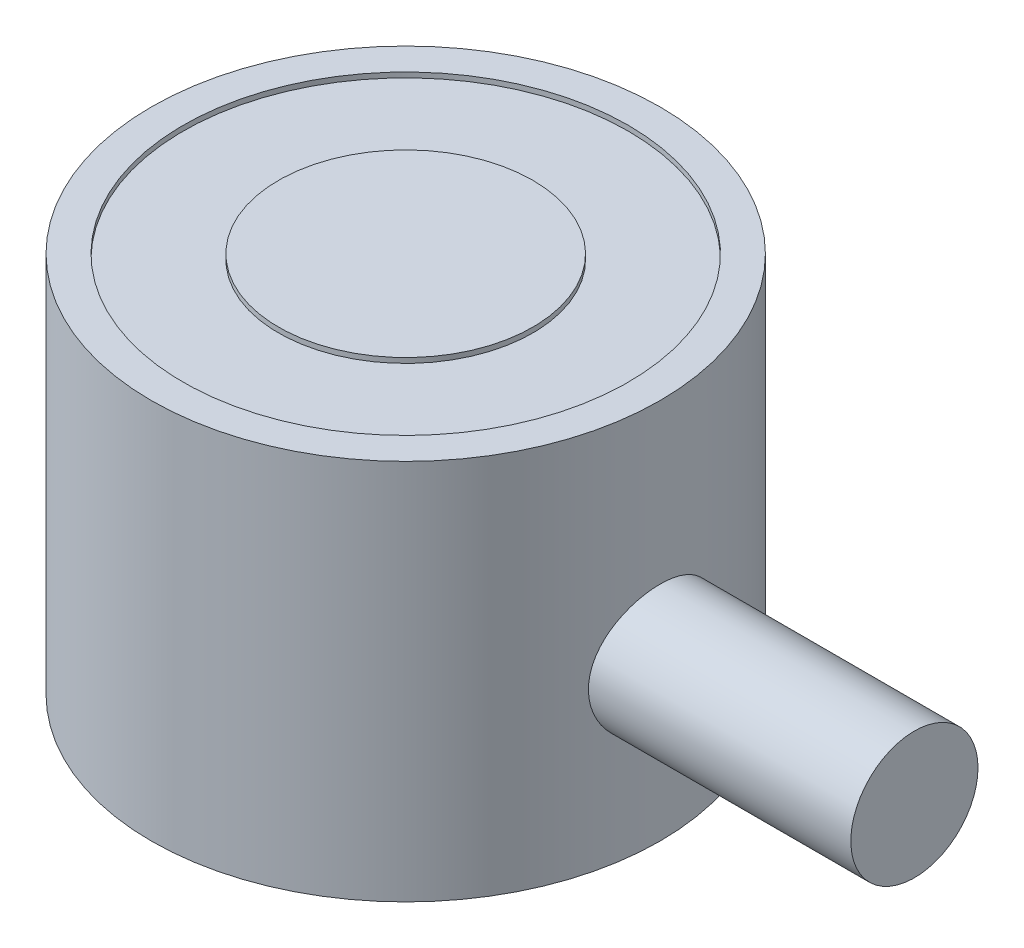
ISO-10303-21;
HEADER;
FILE_DESCRIPTION(('STEP AP214'),'2;1');
FILE_NAME('part.step','',(''),(''),'','','');
FILE_SCHEMA(('AUTOMOTIVE_DESIGN { 1 0 10303 214 1 1 1 1 }'));
ENDSEC;
DATA;
#1=APPLICATION_CONTEXT('core data for automotive mechanical design processes');
#2=APPLICATION_PROTOCOL_DEFINITION('international standard','automotive_design',2000,#1);
#3=PRODUCT_CONTEXT('',#1,'mechanical');
#4=PRODUCT('Part','Part','',(#3));
#5=PRODUCT_RELATED_PRODUCT_CATEGORY('part','',(#4));
#6=PRODUCT_DEFINITION_FORMATION('','',#4);
#7=PRODUCT_DEFINITION_CONTEXT('part definition',#1,'design');
#8=PRODUCT_DEFINITION('design','',#6,#7);
#9=PRODUCT_DEFINITION_SHAPE('','',#8);
#10=(LENGTH_UNIT() NAMED_UNIT(*) SI_UNIT(.MILLI.,.METRE.));
#11=(NAMED_UNIT(*) PLANE_ANGLE_UNIT() SI_UNIT($,.RADIAN.));
#12=(NAMED_UNIT(*) SI_UNIT($,.STERADIAN.) SOLID_ANGLE_UNIT());
#13=UNCERTAINTY_MEASURE_WITH_UNIT(LENGTH_MEASURE(1.E-05),#10,'distance_accuracy_value','');
#14=(GEOMETRIC_REPRESENTATION_CONTEXT(3) GLOBAL_UNCERTAINTY_ASSIGNED_CONTEXT((#13)) GLOBAL_UNIT_ASSIGNED_CONTEXT((#10,
#11,#12)) REPRESENTATION_CONTEXT('',''));
#15=CARTESIAN_POINT('',(0.,0.,0.));
#16=DIRECTION('',(0.,0.,1.));
#17=DIRECTION('',(1.,0.,0.));
#18=AXIS2_PLACEMENT_3D('',#15,#16,#17);
#19=CARTESIAN_POINT('',(0.,0.,0.));
#20=DIRECTION('',(0.,1.,0.));
#21=DIRECTION('',(0.,0.,1.));
#22=AXIS2_PLACEMENT_3D('',#19,#20,#21);
#23=PLANE('',#22);
#24=CARTESIAN_POINT('',(0.,0.,0.));
#25=DIRECTION('',(0.,1.,0.));
#26=DIRECTION('',(0.,0.,1.));
#27=AXIS2_PLACEMENT_3D('',#24,#25,#26);
#28=CIRCLE('',#27,12.7);
#29=CARTESIAN_POINT('',(0.,0.,12.7));
#30=VERTEX_POINT('',#29);
#31=EDGE_CURVE('E39',#30,#30,#28,.T.);
#32=ORIENTED_EDGE('',*,*,#31,.F.);
#33=EDGE_LOOP('',(#32));
#34=FACE_BOUND('',#33,.T.);
#35=CARTESIAN_POINT('',(0.,0.,0.));
#36=DIRECTION('',(0.,-1.,0.));
#37=DIRECTION('',(0.,0.,-1.));
#38=AXIS2_PLACEMENT_3D('',#35,#36,#37);
#39=CIRCLE('',#38,2.49892595803174);
#40=CARTESIAN_POINT('',(0.,0.,-2.49892595803174));
#41=VERTEX_POINT('',#40);
#42=EDGE_CURVE('E60',#41,#41,#39,.T.);
#43=ORIENTED_EDGE('',*,*,#42,.F.);
#44=EDGE_LOOP('',(#43));
#45=FACE_BOUND('',#44,.T.);
#46=ADVANCED_FACE('F31',(#34,#45),#23,.F.);
#47=CARTESIAN_POINT('',(0.,19.05,0.));
#48=DIRECTION('',(0.,1.,0.));
#49=DIRECTION('',(0.,0.,1.));
#50=AXIS2_PLACEMENT_3D('',#47,#48,#49);
#51=PLANE('',#50);
#52=CARTESIAN_POINT('',(0.,19.05,0.));
#53=DIRECTION('',(0.,1.,0.));
#54=DIRECTION('',(0.,0.,1.));
#55=AXIS2_PLACEMENT_3D('',#52,#53,#54);
#56=CIRCLE('',#55,12.7);
#57=CARTESIAN_POINT('',(0.,19.05,12.7));
#58=VERTEX_POINT('',#57);
#59=EDGE_CURVE('E10',#58,#58,#56,.T.);
#60=ORIENTED_EDGE('',*,*,#59,.T.);
#61=EDGE_LOOP('',(#60));
#62=FACE_BOUND('',#61,.T.);
#63=CARTESIAN_POINT('',(0.,19.05,0.));
#64=DIRECTION('',(0.,-1.,0.));
#65=DIRECTION('',(0.,0.,-1.));
#66=AXIS2_PLACEMENT_3D('',#63,#64,#65);
#67=CIRCLE('',#66,11.1125);
#68=CARTESIAN_POINT('',(0.,19.05,-11.1125));
#69=VERTEX_POINT('',#68);
#70=EDGE_CURVE('E51',#69,#69,#67,.T.);
#71=ORIENTED_EDGE('',*,*,#70,.T.);
#72=EDGE_LOOP('',(#71));
#73=FACE_BOUND('',#72,.T.);
#74=ADVANCED_FACE('F91',(#62,#73),#51,.T.);
#75=CARTESIAN_POINT('',(0.,19.05,0.));
#76=DIRECTION('',(0.,-1.,0.));
#77=DIRECTION('',(0.,0.,-1.));
#78=AXIS2_PLACEMENT_3D('',#75,#76,#77);
#79=CYLINDRICAL_SURFACE('',#78,12.7);
#80=CARTESIAN_POINT('',(12.2967221242086,7.9375,-3.175));
#81=CARTESIAN_POINT('',(12.2967254711158,8.11282445367675,-3.1749950198132));
#82=CARTESIAN_POINT('',(12.3005126863854,8.28820402132172,-3.16042833178202));
#83=CARTESIAN_POINT('',(12.3152136473056,8.63392682428036,-3.10263936933902));
#84=CARTESIAN_POINT('',(12.3261315404947,8.80426706817459,-3.05940041756247));
#85=CARTESIAN_POINT('',(12.3537818023711,9.13486049349772,-2.94575382353269));
#86=CARTESIAN_POINT('',(12.3705066621688,9.29512638733985,-2.8753812543752));
#87=CARTESIAN_POINT('',(12.4078770387652,9.60159478272565,-2.70957184940196));
#88=CARTESIAN_POINT('',(12.4285227220068,9.74779668684188,-2.61413394947207));
#89=CARTESIAN_POINT('',(12.4719170977164,10.025204289483,-2.39865970268609));
#90=CARTESIAN_POINT('',(12.4946993898125,10.1560548724446,-2.27817284738414));
#91=CARTESIAN_POINT('',(12.5395085190442,10.3959169708376,-2.01699122140784));
#92=CARTESIAN_POINT('',(12.5615352853931,10.5049264445396,-1.87629456360899));
#93=CARTESIAN_POINT('',(12.6027232771114,10.6994648438917,-1.57625440537027));
#94=CARTESIAN_POINT('',(12.6218402299875,10.7846449129651,-1.4166781117678));
#95=CARTESIAN_POINT('',(12.65467131146,10.9268382480744,-1.08491424405181));
#96=CARTESIAN_POINT('',(12.6683862371462,10.9838556699327,-0.912728534955764));
#97=CARTESIAN_POINT('',(12.6886304373719,11.0669677499148,-0.564335623617785));
#98=CARTESIAN_POINT('',(12.6952996518228,11.0936654482948,-0.388280553827199));
#99=CARTESIAN_POINT('',(12.7011886451627,11.11727314168,-0.0340726004637175));
#100=CARTESIAN_POINT('',(12.7004095254281,11.1141875407062,0.144079969063346));
#101=CARTESIAN_POINT('',(12.6915938059099,11.0787499401823,0.493243384772328));
#102=CARTESIAN_POINT('',(12.6837186297291,11.0470488671816,0.664324984533386));
#103=CARTESIAN_POINT('',(12.6617836238657,10.9563264870384,0.998658935538452));
#104=CARTESIAN_POINT('',(12.6477234649603,10.8973037255707,1.16191086950114));
#105=CARTESIAN_POINT('',(12.6147513732012,10.7530867352274,1.47766628361823));
#106=CARTESIAN_POINT('',(12.5957967501266,10.6676608532796,1.63005931850865));
#107=CARTESIAN_POINT('',(12.5550917783831,10.4732382875224,1.91857510093105));
#108=CARTESIAN_POINT('',(12.5333409435887,10.364237502928,2.05469501139648));
#109=CARTESIAN_POINT('',(12.4887191648708,10.1222698976824,2.31068256139473));
#110=CARTESIAN_POINT('',(12.4658338379713,9.98873428671837,2.43001063106375));
#111=CARTESIAN_POINT('',(12.4220610526701,9.70330803360385,2.64469999368259));
#112=CARTESIAN_POINT('',(12.4011736876753,9.5514165340463,2.74006016644613));
#113=CARTESIAN_POINT('',(12.3637103097324,9.23253165663095,2.90445230964671));
#114=CARTESIAN_POINT('',(12.347155693206,9.06546862250274,2.97335437513118));
#115=CARTESIAN_POINT('',(12.3205067298881,8.72161645554241,3.08192684552051));
#116=CARTESIAN_POINT('',(12.3104110007027,8.54482941273956,3.12160350580598));
#117=CARTESIAN_POINT('',(12.2981130212947,8.191551433057,3.16970364110572));
#118=CARTESIAN_POINT('',(12.2957093300071,8.0151760024569,3.17892490187728));
#119=CARTESIAN_POINT('',(12.2985192607316,7.66340614053673,3.16803657795425));
#120=CARTESIAN_POINT('',(12.3037321815428,7.48801162040421,3.14792969326925));
#121=CARTESIAN_POINT('',(12.3209949412092,7.14614488351531,3.07965533920158));
#122=CARTESIAN_POINT('',(12.3329315220802,6.97957363725712,3.03195236671802));
#123=CARTESIAN_POINT('',(12.3621891219376,6.65679204852627,2.91035496372149));
#124=CARTESIAN_POINT('',(12.3795107787294,6.50058293599915,2.83645743059488));
#125=CARTESIAN_POINT('',(12.418010941113,6.19957957710904,2.66289874827948));
#126=CARTESIAN_POINT('',(12.439258441312,6.05506937314542,2.56276062737126));
#127=CARTESIAN_POINT('',(12.4830469550031,5.78461077924213,2.34016643006688));
#128=CARTESIAN_POINT('',(12.5055881806495,5.65866544585436,2.21770668600727));
#129=CARTESIAN_POINT('',(12.5501070185035,5.42567997593493,1.95028413912651));
#130=CARTESIAN_POINT('',(12.5720564161859,5.31919172056302,1.80483494928781));
#131=CARTESIAN_POINT('',(12.6123346509939,5.13215144897191,1.49765601755559));
#132=CARTESIAN_POINT('',(12.6306636769502,5.05159807990758,1.33592712544035));
#133=CARTESIAN_POINT('',(12.6615204698767,4.91941353614953,1.00189729049621));
#134=CARTESIAN_POINT('',(12.6740898412846,4.86757435883859,0.829682684763526));
#135=CARTESIAN_POINT('',(12.6921932261265,4.79366537504731,0.478630489012212));
#136=CARTESIAN_POINT('',(12.6977285972965,4.77158982340142,0.299794184005939));
#137=CARTESIAN_POINT('',(12.7010848787296,4.75815790309766,-0.05424019645755));
#138=CARTESIAN_POINT('',(12.6991103294396,4.76598707362208,-0.229405900617118));
#139=CARTESIAN_POINT('',(12.6881222125238,4.81027685165956,-0.575841801116832));
#140=CARTESIAN_POINT('',(12.6791088542401,4.84673660766681,-0.747112113154447));
#141=CARTESIAN_POINT('',(12.655087493111,4.94681579777248,-1.08004303817216));
#142=CARTESIAN_POINT('',(12.640112022951,5.01028796427315,-1.24175042029424));
#143=CARTESIAN_POINT('',(12.6057434230086,5.16245658838714,-1.55231164340716));
#144=CARTESIAN_POINT('',(12.5863497364056,5.25115622572879,-1.70116386101838));
#145=CARTESIAN_POINT('',(12.5446551773491,5.45374586793772,-1.98565112274399));
#146=CARTESIAN_POINT('',(12.5222957878978,5.56818845371966,-2.12088408784721));
#147=CARTESIAN_POINT('',(12.4774531075658,5.81794255502808,-2.37050268936837));
#148=CARTESIAN_POINT('',(12.4549697867118,5.95325935365294,-2.48488303211817));
#149=CARTESIAN_POINT('',(12.4119473580947,6.24395949005154,-2.69164443404806));
#150=CARTESIAN_POINT('',(12.3914523466269,6.39967009168468,-2.783575266647));
#151=CARTESIAN_POINT('',(12.3553205869608,6.72482618035255,-2.93981789665886));
#152=CARTESIAN_POINT('',(12.3396803064045,6.89426156734796,-3.00414978846308));
#153=CARTESIAN_POINT('',(12.3174731028359,7.20908201257663,-3.09379152821293));
#154=CARTESIAN_POINT('',(12.3097500503611,7.35296079692598,-3.12417831664509));
#155=CARTESIAN_POINT('',(12.2993733749982,7.64371365906766,-3.16478377891537));
#156=CARTESIAN_POINT('',(12.2967193196792,7.79058748027598,-3.17500417313031));
#157=CARTESIAN_POINT('',(12.2967221242086,7.9375,-3.175));
#158=B_SPLINE_CURVE_WITH_KNOTS('',3,(#80,#81,#82,#83,#84,#85,#86,#87,#88,#89,#90,#91,#92,#93,
#94,#95,#96,#97,#98,#99,#100,#101,#102,#103,#104,#105,#106,#107,#108,#109,#110,#111,#112,#113,
#114,#115,#116,#117,#118,#119,#120,#121,#122,#123,#124,#125,#126,#127,#128,#129,#130,#131,#132,
#133,#134,#135,#136,#137,#138,#139,#140,#141,#142,#143,#144,#145,#146,#147,#148,#149,#150,#151,
#152,#153,#154,#155,#156,#157),.UNSPECIFIED.,.T.,.F.,(4,2,2,2,2,2,2,2,2,2,2,2,2,2,2,2,2,2,2,2,2,
2,2,2,2,2,2,2,2,2,2,2,2,2,2,2,2,2,4),(0.,0.525433851004891,1.05117359161441,1.57623602350085,
2.10132074979458,2.6368242182508,3.1723777227943,3.71540400425358,4.25835013005807,
4.7902971376409,5.32216548805846,5.84223193614962,6.36232607040478,6.88711950303144,
7.4120042954552,7.95109492546327,8.49021074623748,9.03194068650671,9.57355464164525,
10.1008633995054,10.6281236152971,11.1467570436797,11.6654519221148,12.1943221424741,
12.7232793399029,13.2654717033223,13.8076357797011,14.3458193247108,14.8838989712076,
15.4074297658815,15.9309449907505,16.4516419323711,16.9724045329363,17.5056431266551,
18.0390169009448,18.5823412615974,19.1252693614627,19.5655924052587,20.0058778838705),.UNSPECIFIED.);
#159=CARTESIAN_POINT('',(12.2967221242086,7.9375,-3.175));
#160=VERTEX_POINT('',#159);
#161=EDGE_CURVE('E63',#160,#160,#158,.T.);
#162=ORIENTED_EDGE('',*,*,#161,.F.);
#163=EDGE_LOOP('',(#162));
#164=FACE_BOUND('',#163,.T.);
#165=ORIENTED_EDGE('',*,*,#59,.F.);
#166=EDGE_LOOP('',(#165));
#167=FACE_BOUND('',#166,.T.);
#168=ORIENTED_EDGE('',*,*,#31,.T.);
#169=EDGE_LOOP('',(#168));
#170=FACE_BOUND('',#169,.T.);
#171=ADVANCED_FACE('F33',(#164,#167,#170),#79,.T.);
#172=CARTESIAN_POINT('',(-11.1125,18.796,0.));
#173=DIRECTION('',(0.,1.,0.));
#174=DIRECTION('',(0.,0.,1.));
#175=AXIS2_PLACEMENT_3D('',#172,#173,#174);
#176=PLANE('',#175);
#177=CARTESIAN_POINT('',(0.,18.796,0.));
#178=DIRECTION('',(0.,-1.,0.));
#179=DIRECTION('',(0.,0.,-1.));
#180=AXIS2_PLACEMENT_3D('',#177,#178,#179);
#181=CIRCLE('',#180,6.35);
#182=CARTESIAN_POINT('',(0.,18.796,-6.35));
#183=VERTEX_POINT('',#182);
#184=EDGE_CURVE('E44',#183,#183,#181,.T.);
#185=ORIENTED_EDGE('',*,*,#184,.T.);
#186=EDGE_LOOP('',(#185));
#187=FACE_BOUND('',#186,.T.);
#188=CARTESIAN_POINT('',(0.,18.796,0.));
#189=DIRECTION('',(0.,-1.,0.));
#190=DIRECTION('',(0.,0.,-1.));
#191=AXIS2_PLACEMENT_3D('',#188,#189,#190);
#192=CIRCLE('',#191,11.1125);
#193=CARTESIAN_POINT('',(0.,18.796,-11.1125));
#194=VERTEX_POINT('',#193);
#195=EDGE_CURVE('E54',#194,#194,#192,.T.);
#196=ORIENTED_EDGE('',*,*,#195,.F.);
#197=EDGE_LOOP('',(#196));
#198=FACE_BOUND('',#197,.T.);
#199=ADVANCED_FACE('F105',(#187,#198),#176,.T.);
#200=CARTESIAN_POINT('',(0.,0.,0.));
#201=DIRECTION('',(0.,-1.,0.));
#202=DIRECTION('',(0.,0.,-1.));
#203=AXIS2_PLACEMENT_3D('',#200,#201,#202);
#204=CYLINDRICAL_SURFACE('',#203,6.35);
#205=CARTESIAN_POINT('',(0.,19.05,0.));
#206=DIRECTION('',(0.,-1.,0.));
#207=DIRECTION('',(0.,0.,-1.));
#208=AXIS2_PLACEMENT_3D('',#205,#206,#207);
#209=CIRCLE('',#208,6.35);
#210=CARTESIAN_POINT('',(0.,19.05,-6.35));
#211=VERTEX_POINT('',#210);
#212=EDGE_CURVE('E48',#211,#211,#209,.T.);
#213=ORIENTED_EDGE('',*,*,#212,.T.);
#214=EDGE_LOOP('',(#213));
#215=FACE_BOUND('',#214,.T.);
#216=ORIENTED_EDGE('',*,*,#184,.F.);
#217=EDGE_LOOP('',(#216));
#218=FACE_BOUND('',#217,.T.);
#219=ADVANCED_FACE('F108',(#215,#218),#204,.T.);
#220=CARTESIAN_POINT('',(0.,0.,0.));
#221=DIRECTION('',(0.,-1.,0.));
#222=DIRECTION('',(0.,0.,-1.));
#223=AXIS2_PLACEMENT_3D('',#220,#221,#222);
#224=CYLINDRICAL_SURFACE('',#223,11.1125);
#225=ORIENTED_EDGE('',*,*,#195,.T.);
#226=EDGE_LOOP('',(#225));
#227=FACE_BOUND('',#226,.T.);
#228=ORIENTED_EDGE('',*,*,#70,.F.);
#229=EDGE_LOOP('',(#228));
#230=FACE_BOUND('',#229,.T.);
#231=ADVANCED_FACE('F103',(#227,#230),#224,.F.);
#232=ORIENTED_EDGE('',*,*,#212,.F.);
#233=EDGE_LOOP('',(#232));
#234=FACE_BOUND('',#233,.T.);
#235=ADVANCED_FACE('F97',(#234),#51,.T.);
#236=CARTESIAN_POINT('',(0.,0.,0.));
#237=DIRECTION('',(0.,-1.,0.));
#238=DIRECTION('',(0.,0.,-1.));
#239=AXIS2_PLACEMENT_3D('',#236,#237,#238);
#240=CONICAL_SURFACE('',#239,2.49892595803174,0.78539816339745);
#241=ORIENTED_EDGE('',*,*,#42,.T.);
#242=EDGE_LOOP('',(#241));
#243=FACE_BOUND('',#242,.T.);
#244=CARTESIAN_POINT('',(0.,0.0859259580317367,0.));
#245=DIRECTION('',(0.,-1.,0.));
#246=DIRECTION('',(0.,0.,-1.));
#247=AXIS2_PLACEMENT_3D('',#244,#245,#246);
#248=CIRCLE('',#247,2.413);
#249=CARTESIAN_POINT('',(0.,0.0859259580317379,-2.413));
#250=VERTEX_POINT('',#249);
#251=EDGE_CURVE('E35',#250,#250,#248,.T.);
#252=ORIENTED_EDGE('',*,*,#251,.F.);
#253=EDGE_LOOP('',(#252));
#254=FACE_BOUND('',#253,.T.);
#255=ADVANCED_FACE('F102',(#243,#254),#240,.F.);
#256=CARTESIAN_POINT('',(0.,9.525,0.));
#257=DIRECTION('',(0.,-1.,0.));
#258=DIRECTION('',(0.,0.,-1.));
#259=AXIS2_PLACEMENT_3D('',#256,#257,#258);
#260=PLANE('',#259);
#261=CARTESIAN_POINT('',(0.,9.525,0.));
#262=DIRECTION('',(0.,-1.,0.));
#263=DIRECTION('',(0.,0.,-1.));
#264=AXIS2_PLACEMENT_3D('',#261,#262,#263);
#265=CIRCLE('',#264,2.413);
#266=CARTESIAN_POINT('',(0.,9.525,-2.413));
#267=VERTEX_POINT('',#266);
#268=EDGE_CURVE('E57',#267,#267,#265,.T.);
#269=ORIENTED_EDGE('',*,*,#268,.T.);
#270=EDGE_LOOP('',(#269));
#271=FACE_BOUND('',#270,.T.);
#272=ADVANCED_FACE('F86',(#271),#260,.T.);
#273=CARTESIAN_POINT('',(0.,9.525,0.));
#274=DIRECTION('',(0.,-1.,0.));
#275=DIRECTION('',(0.,0.,-1.));
#276=AXIS2_PLACEMENT_3D('',#273,#274,#275);
#277=CYLINDRICAL_SURFACE('',#276,2.413);
#278=CARTESIAN_POINT('',(0.,0.0859259580317379,-2.413));
#279=CARTESIAN_POINT('',(0.,0.184249645968907,-2.413));
#280=CARTESIAN_POINT('',(0.,0.282573333906076,-2.413));
#281=CARTESIAN_POINT('',(0.,0.479220709780415,-2.413));
#282=CARTESIAN_POINT('',(0.,0.577544397717584,-2.413));
#283=CARTESIAN_POINT('',(0.,0.774191773591924,-2.413));
#284=CARTESIAN_POINT('',(0.,0.872515461529094,-2.413));
#285=CARTESIAN_POINT('',(0.,1.06916283740343,-2.413));
#286=CARTESIAN_POINT('',(0.,1.1674865253406,-2.413));
#287=CARTESIAN_POINT('',(0.,1.36413390121494,-2.413));
#288=CARTESIAN_POINT('',(0.,1.46245758915211,-2.413));
#289=CARTESIAN_POINT('',(0.,1.65910496502645,-2.413));
#290=CARTESIAN_POINT('',(0.,1.75742865296362,-2.413));
#291=CARTESIAN_POINT('',(0.,1.95407602883796,-2.413));
#292=CARTESIAN_POINT('',(0.,2.05239971677513,-2.413));
#293=CARTESIAN_POINT('',(0.,2.24904709264946,-2.413));
#294=CARTESIAN_POINT('',(0.,2.34737078058663,-2.413));
#295=CARTESIAN_POINT('',(0.,2.54401815646097,-2.413));
#296=CARTESIAN_POINT('',(0.,2.64234184439814,-2.413));
#297=CARTESIAN_POINT('',(0.,2.83898922027248,-2.413));
#298=CARTESIAN_POINT('',(0.,2.93731290820965,-2.413));
#299=CARTESIAN_POINT('',(0.,3.13396028408399,-2.413));
#300=CARTESIAN_POINT('',(0.,3.23228397202116,-2.413));
#301=CARTESIAN_POINT('',(0.,3.4289313478955,-2.413));
#302=CARTESIAN_POINT('',(0.,3.52725503583267,-2.413));
#303=CARTESIAN_POINT('',(0.,3.72390241170701,-2.413));
#304=CARTESIAN_POINT('',(0.,3.82222609964418,-2.413));
#305=CARTESIAN_POINT('',(0.,4.01887347551851,-2.413));
#306=CARTESIAN_POINT('',(0.,4.11719716345568,-2.413));
#307=CARTESIAN_POINT('',(0.,4.31384453933002,-2.413));
#308=CARTESIAN_POINT('',(0.,4.41216822726719,-2.413));
#309=CARTESIAN_POINT('',(0.,4.60881560314153,-2.413));
#310=CARTESIAN_POINT('',(0.,4.7071392910787,-2.413));
#311=CARTESIAN_POINT('',(0.,4.90378666695304,-2.413));
#312=CARTESIAN_POINT('',(0.,5.00211035489021,-2.413));
#313=CARTESIAN_POINT('',(0.,5.19875773076455,-2.413));
#314=CARTESIAN_POINT('',(0.,5.29708141870172,-2.413));
#315=CARTESIAN_POINT('',(0.,5.49372879457606,-2.413));
#316=CARTESIAN_POINT('',(0.,5.59205248251322,-2.413));
#317=CARTESIAN_POINT('',(0.,5.78869985838756,-2.413));
#318=CARTESIAN_POINT('',(0.,5.88702354632473,-2.413));
#319=CARTESIAN_POINT('',(0.,6.08367092219907,-2.413));
#320=CARTESIAN_POINT('',(0.,6.18199461013624,-2.413));
#321=CARTESIAN_POINT('',(0.,6.37864198601058,-2.413));
#322=CARTESIAN_POINT('',(0.,6.47696567394775,-2.413));
#323=CARTESIAN_POINT('',(0.,6.67361304982209,-2.413));
#324=CARTESIAN_POINT('',(0.,6.77193673775926,-2.413));
#325=CARTESIAN_POINT('',(0.,6.9685841136336,-2.413));
#326=CARTESIAN_POINT('',(0.,7.06690780157077,-2.413));
#327=CARTESIAN_POINT('',(0.,7.26355517744511,-2.413));
#328=CARTESIAN_POINT('',(0.,7.36187886538228,-2.413));
#329=CARTESIAN_POINT('',(0.,7.55852624125661,-2.413));
#330=CARTESIAN_POINT('',(0.,7.65684992919378,-2.413));
#331=CARTESIAN_POINT('',(0.,7.85349730506812,-2.413));
#332=CARTESIAN_POINT('',(0.,7.95182099300529,-2.413));
#333=CARTESIAN_POINT('',(0.,8.14846836887963,-2.413));
#334=CARTESIAN_POINT('',(0.,8.2467920568168,-2.413));
#335=CARTESIAN_POINT('',(0.,8.44343943269114,-2.413));
#336=CARTESIAN_POINT('',(0.,8.54176312062831,-2.413));
#337=CARTESIAN_POINT('',(0.,8.73841049650265,-2.413));
#338=CARTESIAN_POINT('',(0.,8.83673418443982,-2.413));
#339=CARTESIAN_POINT('',(0.,9.03338156031416,-2.413));
#340=CARTESIAN_POINT('',(0.,9.13170524825132,-2.413));
#341=CARTESIAN_POINT('',(0.,9.32835262412566,-2.413));
#342=CARTESIAN_POINT('',(0.,9.42667631206283,-2.413));
#343=CARTESIAN_POINT('',(0.,9.525,-2.413));
#344=B_SPLINE_CURVE_WITH_KNOTS('',3,(#278,#279,#280,#281,#282,#283,#284,#285,#286,#287,#288,
#289,#290,#291,#292,#293,#294,#295,#296,#297,#298,#299,#300,#301,#302,#303,#304,#305,#306,#307,
#308,#309,#310,#311,#312,#313,#314,#315,#316,#317,#318,#319,#320,#321,#322,#323,#324,#325,#326,
#327,#328,#329,#330,#331,#332,#333,#334,#335,#336,#337,#338,#339,#340,#341,#342,#343),
.UNSPECIFIED.,.F.,.F.,(4,2,2,2,2,2,2,2,2,2,2,2,2,2,2,2,2,2,2,2,2,2,2,2,2,2,2,2,2,2,2,2,4),(0.,
0.294971063811508,0.589942127623016,0.884913191434526,1.17988425524603,1.47485531905754,
1.76982638286905,2.06479744668056,2.35976851049207,2.65473957430357,2.94971063811508,
3.24468170192659,3.5396527657381,3.83462382954961,4.12959489336112,4.42456595717262,
4.71953702098413,5.01450808479564,5.30947914860715,5.60445021241866,5.89942127623017,
6.19439234004167,6.48936340385318,6.78433446766469,7.0793055314762,7.37427659528771,
7.66924765909921,7.96421872291072,8.25918978672223,8.55416085053374,8.84913191434525,
9.14410297815676,9.43907404196827),.UNSPECIFIED.);
#345=EDGE_CURVE('BSEAM79',#250,#267,#344,.T.);
#346=ORIENTED_EDGE('',*,*,#251,.T.);
#347=ORIENTED_EDGE('',*,*,#268,.F.);
#348=ORIENTED_EDGE('',*,*,#345,.T.);
#349=ORIENTED_EDGE('',*,*,#345,.F.);
#350=EDGE_LOOP('',(#346,#348,#347,#349));
#351=FACE_BOUND('',#350,.T.);
#352=ADVANCED_FACE('F79',(#351),#277,.F.);
#353=CARTESIAN_POINT('',(25.4,7.9375,0.));
#354=DIRECTION('',(1.,0.,0.));
#355=DIRECTION('',(0.,0.,-1.));
#356=AXIS2_PLACEMENT_3D('',#353,#354,#355);
#357=PLANE('',#356);
#358=CARTESIAN_POINT('',(25.4,7.9375,0.));
#359=DIRECTION('',(1.,0.,0.));
#360=DIRECTION('',(0.,0.,-1.));
#361=AXIS2_PLACEMENT_3D('',#358,#359,#360);
#362=CIRCLE('',#361,3.175);
#363=CARTESIAN_POINT('',(25.4,7.9375,-3.175));
#364=VERTEX_POINT('',#363);
#365=EDGE_CURVE('E71',#364,#364,#362,.T.);
#366=ORIENTED_EDGE('',*,*,#365,.T.);
#367=EDGE_LOOP('',(#366));
#368=FACE_BOUND('',#367,.T.);
#369=ADVANCED_FACE('F77',(#368),#357,.T.);
#370=CARTESIAN_POINT('',(-12.701,7.9375,0.));
#371=DIRECTION('',(1.,0.,0.));
#372=DIRECTION('',(0.,0.,-1.));
#373=AXIS2_PLACEMENT_3D('',#370,#371,#372);
#374=CYLINDRICAL_SURFACE('',#373,3.175);
#375=ORIENTED_EDGE('',*,*,#365,.F.);
#376=EDGE_LOOP('',(#375));
#377=FACE_BOUND('',#376,.T.);
#378=ORIENTED_EDGE('',*,*,#161,.T.);
#379=EDGE_LOOP('',(#378));
#380=FACE_BOUND('',#379,.T.);
#381=ADVANCED_FACE('F72',(#377,#380),#374,.T.);
#382=CLOSED_SHELL('',(#46,#74,#171,#199,#219,#231,#235,#255,#272,#352,#369,#381));
#383=MANIFOLD_SOLID_BREP('B2',#382);
#384=ADVANCED_BREP_SHAPE_REPRESENTATION('',(#18,#383),#14);
#385=SHAPE_DEFINITION_REPRESENTATION(#9,#384);
ENDSEC;
END-ISO-10303-21;
